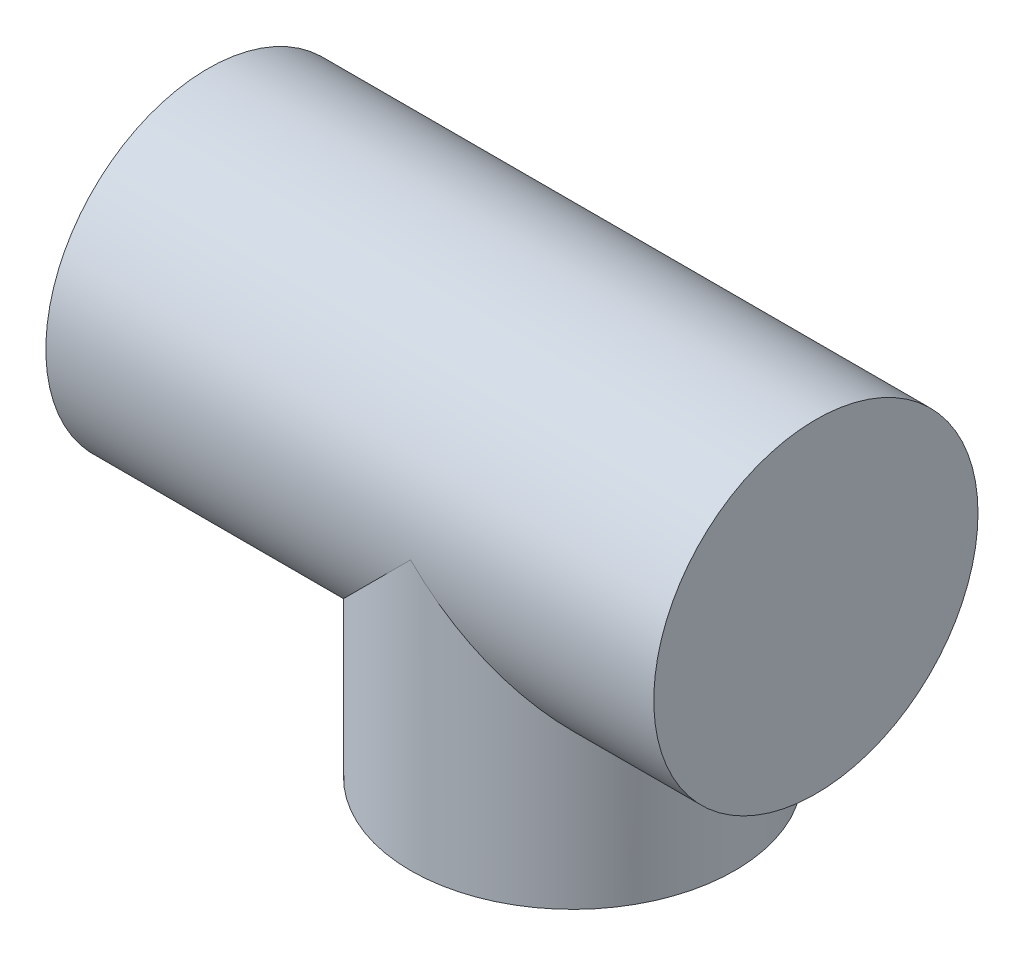
ISO-10303-21;
HEADER;
FILE_DESCRIPTION(('STEP AP214'),'2;1');
FILE_NAME('part.step','',(''),(''),'','','');
FILE_SCHEMA(('AUTOMOTIVE_DESIGN { 1 0 10303 214 1 1 1 1 }'));
ENDSEC;
DATA;
#1=APPLICATION_CONTEXT('core data for automotive mechanical design processes');
#2=APPLICATION_PROTOCOL_DEFINITION('international standard','automotive_design',2000,#1);
#3=PRODUCT_CONTEXT('',#1,'mechanical');
#4=PRODUCT('Part','Part','',(#3));
#5=PRODUCT_RELATED_PRODUCT_CATEGORY('part','',(#4));
#6=PRODUCT_DEFINITION_FORMATION('','',#4);
#7=PRODUCT_DEFINITION_CONTEXT('part definition',#1,'design');
#8=PRODUCT_DEFINITION('design','',#6,#7);
#9=PRODUCT_DEFINITION_SHAPE('','',#8);
#10=(LENGTH_UNIT() NAMED_UNIT(*) SI_UNIT(.MILLI.,.METRE.));
#11=(NAMED_UNIT(*) PLANE_ANGLE_UNIT() SI_UNIT($,.RADIAN.));
#12=(NAMED_UNIT(*) SI_UNIT($,.STERADIAN.) SOLID_ANGLE_UNIT());
#13=UNCERTAINTY_MEASURE_WITH_UNIT(LENGTH_MEASURE(1.E-05),#10,'distance_accuracy_value','');
#14=(GEOMETRIC_REPRESENTATION_CONTEXT(3) GLOBAL_UNCERTAINTY_ASSIGNED_CONTEXT((#13)) GLOBAL_UNIT_ASSIGNED_CONTEXT((#10,
#11,#12)) REPRESENTATION_CONTEXT('',''));
#15=CARTESIAN_POINT('',(0.,0.,0.));
#16=DIRECTION('',(0.,0.,1.));
#17=DIRECTION('',(1.,0.,0.));
#18=AXIS2_PLACEMENT_3D('',#15,#16,#17);
#19=CARTESIAN_POINT('',(0.,0.,0.));
#20=DIRECTION('',(1.,0.,0.));
#21=DIRECTION('',(0.,0.,-1.));
#22=AXIS2_PLACEMENT_3D('',#19,#20,#21);
#23=PLANE('',#22);
#24=CARTESIAN_POINT('',(0.,0.,0.));
#25=DIRECTION('',(1.,0.,0.));
#26=DIRECTION('',(0.,0.,-1.));
#27=AXIS2_PLACEMENT_3D('',#24,#25,#26);
#28=CIRCLE('',#27,20.);
#29=CARTESIAN_POINT('',(0.,0.,-20.));
#30=VERTEX_POINT('',#29);
#31=EDGE_CURVE('E36',#30,#30,#28,.T.);
#32=ORIENTED_EDGE('',*,*,#31,.F.);
#33=EDGE_LOOP('',(#32));
#34=FACE_BOUND('',#33,.T.);
#35=ADVANCED_FACE('F17',(#34),#23,.F.);
#36=CARTESIAN_POINT('',(75.,0.,0.));
#37=DIRECTION('',(1.,0.,0.));
#38=DIRECTION('',(0.,0.,-1.));
#39=AXIS2_PLACEMENT_3D('',#36,#37,#38);
#40=PLANE('',#39);
#41=CARTESIAN_POINT('',(75.,0.,0.));
#42=DIRECTION('',(1.,0.,0.));
#43=DIRECTION('',(0.,0.,-1.));
#44=AXIS2_PLACEMENT_3D('',#41,#42,#43);
#45=CIRCLE('',#44,20.);
#46=CARTESIAN_POINT('',(75.,0.,-20.));
#47=VERTEX_POINT('',#46);
#48=EDGE_CURVE('E34',#47,#47,#45,.T.);
#49=ORIENTED_EDGE('',*,*,#48,.T.);
#50=EDGE_LOOP('',(#49));
#51=FACE_BOUND('',#50,.T.);
#52=ADVANCED_FACE('F55',(#51),#40,.T.);
#53=CARTESIAN_POINT('',(0.,0.,0.));
#54=DIRECTION('',(1.,0.,0.));
#55=DIRECTION('',(0.,0.,-1.));
#56=AXIS2_PLACEMENT_3D('',#53,#54,#55);
#57=CYLINDRICAL_SURFACE('',#56,20.);
#58=CARTESIAN_POINT('',(45.,0.,0.));
#59=DIRECTION('',(0.707106781186548,0.707106781186548,0.));
#60=DIRECTION('',(0.707106781186548,-0.707106781186548,0.));
#61=AXIS2_PLACEMENT_3D('',#58,#59,#60);
#62=ELLIPSE('',#61,28.2842712474619,20.);
#63=CARTESIAN_POINT('',(45.,0.,-20.));
#64=VERTEX_POINT('',#63);
#65=CARTESIAN_POINT('',(45.,0.,20.));
#66=VERTEX_POINT('',#65);
#67=EDGE_CURVE('E11',#64,#66,#62,.F.);
#68=ORIENTED_EDGE('',*,*,#67,.F.);
#69=CARTESIAN_POINT('',(45.,0.,0.));
#70=DIRECTION('',(0.707106781186548,-0.707106781186548,0.));
#71=DIRECTION('',(0.707106781186548,0.707106781186548,0.));
#72=AXIS2_PLACEMENT_3D('',#69,#70,#71);
#73=ELLIPSE('',#72,28.2842712474619,20.);
#74=EDGE_CURVE('E24',#66,#64,#73,.T.);
#75=ORIENTED_EDGE('',*,*,#74,.F.);
#76=EDGE_LOOP('',(#68,#75));
#77=FACE_BOUND('',#76,.T.);
#78=ORIENTED_EDGE('',*,*,#48,.F.);
#79=EDGE_LOOP('',(#78));
#80=FACE_BOUND('',#79,.T.);
#81=ORIENTED_EDGE('',*,*,#31,.T.);
#82=EDGE_LOOP('',(#81));
#83=FACE_BOUND('',#82,.T.);
#84=ADVANCED_FACE('F30',(#77,#80,#83),#57,.T.);
#85=CARTESIAN_POINT('',(45.,-33.2,0.));
#86=DIRECTION('',(0.,1.,0.));
#87=DIRECTION('',(0.,0.,1.));
#88=AXIS2_PLACEMENT_3D('',#85,#86,#87);
#89=CYLINDRICAL_SURFACE('',#88,20.);
#90=CARTESIAN_POINT('',(45.,-33.2,0.));
#91=DIRECTION('',(0.,1.,0.));
#92=DIRECTION('',(0.,0.,1.));
#93=AXIS2_PLACEMENT_3D('',#90,#91,#92);
#94=CIRCLE('',#93,20.);
#95=CARTESIAN_POINT('',(45.,-33.2,20.));
#96=VERTEX_POINT('',#95);
#97=EDGE_CURVE('E41',#96,#96,#94,.T.);
#98=ORIENTED_EDGE('',*,*,#97,.T.);
#99=EDGE_LOOP('',(#98));
#100=FACE_BOUND('',#99,.T.);
#101=ORIENTED_EDGE('',*,*,#74,.T.);
#102=ORIENTED_EDGE('',*,*,#67,.T.);
#103=EDGE_LOOP('',(#101,#102));
#104=FACE_BOUND('',#103,.T.);
#105=ADVANCED_FACE('F33',(#100,#104),#89,.T.);
#106=CARTESIAN_POINT('',(45.,-33.2,0.));
#107=DIRECTION('',(0.,1.,0.));
#108=DIRECTION('',(0.,0.,1.));
#109=AXIS2_PLACEMENT_3D('',#106,#107,#108);
#110=PLANE('',#109);
#111=ORIENTED_EDGE('',*,*,#97,.F.);
#112=EDGE_LOOP('',(#111));
#113=FACE_BOUND('',#112,.T.);
#114=ADVANCED_FACE('F46',(#113),#110,.F.);
#115=CLOSED_SHELL('',(#35,#52,#84,#105,#114));
#116=MANIFOLD_SOLID_BREP('B1',#115);
#117=ADVANCED_BREP_SHAPE_REPRESENTATION('',(#18,#116),#14);
#118=SHAPE_DEFINITION_REPRESENTATION(#9,#117);
ENDSEC;
END-ISO-10303-21;
